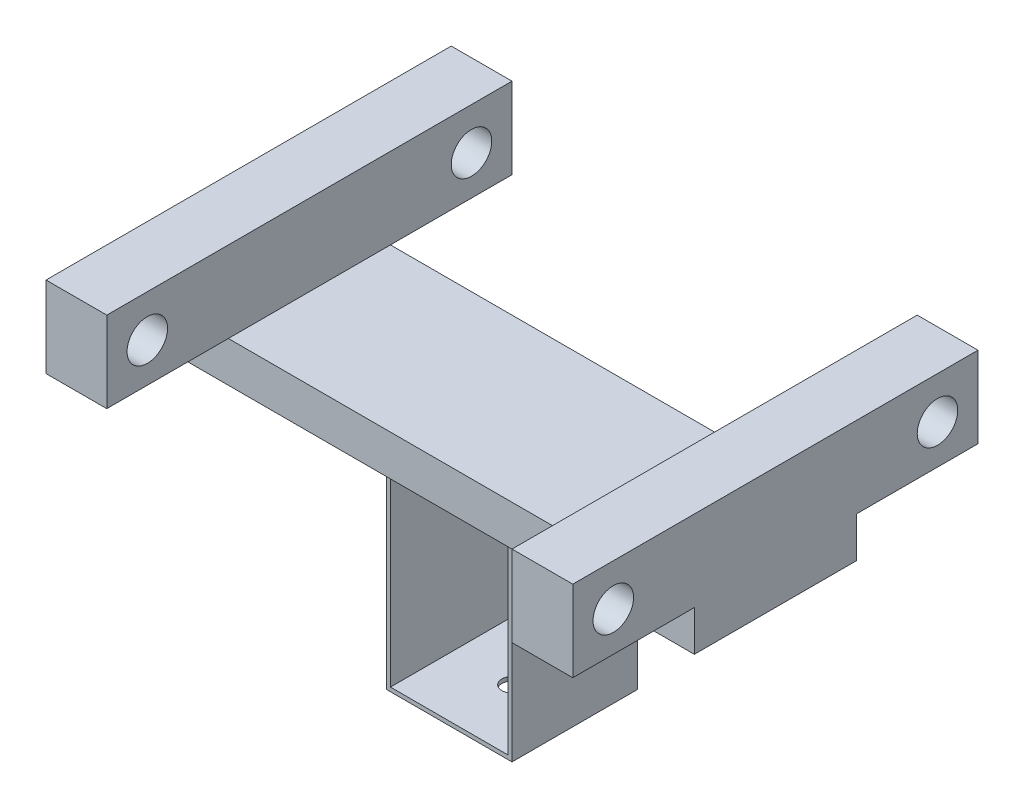
ISO-10303-21;
HEADER;
FILE_DESCRIPTION(('STEP AP214'),'2;1');
FILE_NAME('part.step','',(''),(''),'','','');
FILE_SCHEMA(('AUTOMOTIVE_DESIGN { 1 0 10303 214 1 1 1 1 }'));
ENDSEC;
DATA;
#1=APPLICATION_CONTEXT('core data for automotive mechanical design processes');
#2=APPLICATION_PROTOCOL_DEFINITION('international standard','automotive_design',2000,#1);
#3=PRODUCT_CONTEXT('',#1,'mechanical');
#4=PRODUCT('Part','Part','',(#3));
#5=PRODUCT_RELATED_PRODUCT_CATEGORY('part','',(#4));
#6=PRODUCT_DEFINITION_FORMATION('','',#4);
#7=PRODUCT_DEFINITION_CONTEXT('part definition',#1,'design');
#8=PRODUCT_DEFINITION('design','',#6,#7);
#9=PRODUCT_DEFINITION_SHAPE('','',#8);
#10=(LENGTH_UNIT() NAMED_UNIT(*) SI_UNIT(.MILLI.,.METRE.));
#11=(NAMED_UNIT(*) PLANE_ANGLE_UNIT() SI_UNIT($,.RADIAN.));
#12=(NAMED_UNIT(*) SI_UNIT($,.STERADIAN.) SOLID_ANGLE_UNIT());
#13=UNCERTAINTY_MEASURE_WITH_UNIT(LENGTH_MEASURE(1.E-05),#10,'distance_accuracy_value','');
#14=(GEOMETRIC_REPRESENTATION_CONTEXT(3) GLOBAL_UNCERTAINTY_ASSIGNED_CONTEXT((#13)) GLOBAL_UNIT_ASSIGNED_CONTEXT((#10,
#11,#12)) REPRESENTATION_CONTEXT('',''));
#15=CARTESIAN_POINT('',(0.,0.,0.));
#16=DIRECTION('',(0.,0.,1.));
#17=DIRECTION('',(1.,0.,0.));
#18=AXIS2_PLACEMENT_3D('',#15,#16,#17);
#19=CARTESIAN_POINT('',(0.,10.,0.));
#20=DIRECTION('',(0.,1.,0.));
#21=DIRECTION('',(0.,0.,1.));
#22=AXIS2_PLACEMENT_3D('',#19,#20,#21);
#23=PLANE('',#22);
#24=DIRECTION('',(1.,0.,0.));
#25=VECTOR('',#24,1.);
#26=CARTESIAN_POINT('',(-65.,10.,20.));
#27=LINE('',#26,#25);
#28=CARTESIAN_POINT('',(-50.,10.,20.));
#29=VERTEX_POINT('',#28);
#30=CARTESIAN_POINT('',(50.,10.,20.));
#31=VERTEX_POINT('',#30);
#32=EDGE_CURVE('E424',#29,#31,#27,.T.);
#33=ORIENTED_EDGE('',*,*,#32,.T.);
#34=DIRECTION('',(0.,0.,1.));
#35=VECTOR('',#34,1.);
#36=CARTESIAN_POINT('',(50.,10.,-50.));
#37=LINE('',#36,#35);
#38=CARTESIAN_POINT('',(50.,10.,-20.));
#39=VERTEX_POINT('',#38);
#40=EDGE_CURVE('E60',#39,#31,#37,.T.);
#41=ORIENTED_EDGE('',*,*,#40,.F.);
#42=DIRECTION('',(-1.,0.,0.));
#43=VECTOR('',#42,1.);
#44=CARTESIAN_POINT('',(-65.,10.,-20.));
#45=LINE('',#44,#43);
#46=CARTESIAN_POINT('',(-50.,10.,-20.));
#47=VERTEX_POINT('',#46);
#48=EDGE_CURVE('E417',#39,#47,#45,.T.);
#49=ORIENTED_EDGE('',*,*,#48,.T.);
#50=DIRECTION('',(0.,0.,1.));
#51=VECTOR('',#50,1.);
#52=CARTESIAN_POINT('',(-50.,10.,-50.));
#53=LINE('',#52,#51);
#54=EDGE_CURVE('E11',#47,#29,#53,.T.);
#55=ORIENTED_EDGE('',*,*,#54,.T.);
#56=EDGE_LOOP('',(#33,#41,#49,#55));
#57=FACE_BOUND('',#56,.T.);
#58=ADVANCED_FACE('F41',(#57),#23,.T.);
#59=CARTESIAN_POINT('',(0.,0.,0.));
#60=DIRECTION('',(0.,1.,0.));
#61=DIRECTION('',(0.,0.,1.));
#62=AXIS2_PLACEMENT_3D('',#59,#60,#61);
#63=PLANE('',#62);
#64=DIRECTION('',(0.,0.,-1.));
#65=VECTOR('',#64,1.);
#66=CARTESIAN_POINT('',(65.,0.,-20.));
#67=LINE('',#66,#65);
#68=CARTESIAN_POINT('',(65.,0.,20.));
#69=VERTEX_POINT('',#68);
#70=CARTESIAN_POINT('',(65.,0.,-20.));
#71=VERTEX_POINT('',#70);
#72=EDGE_CURVE('E412',#69,#71,#67,.T.);
#73=ORIENTED_EDGE('',*,*,#72,.F.);
#74=DIRECTION('',(1.,0.,0.));
#75=VECTOR('',#74,1.);
#76=CARTESIAN_POINT('',(-65.,0.,20.));
#77=LINE('',#76,#75);
#78=CARTESIAN_POINT('',(-65.,0.,20.));
#79=VERTEX_POINT('',#78);
#80=EDGE_CURVE('E433',#79,#69,#77,.T.);
#81=ORIENTED_EDGE('',*,*,#80,.F.);
#82=DIRECTION('',(0.,0.,1.));
#83=VECTOR('',#82,1.);
#84=CARTESIAN_POINT('',(-65.,0.,-20.));
#85=LINE('',#84,#83);
#86=CARTESIAN_POINT('',(-65.,0.,-20.));
#87=VERTEX_POINT('',#86);
#88=EDGE_CURVE('E430',#87,#79,#85,.T.);
#89=ORIENTED_EDGE('',*,*,#88,.F.);
#90=DIRECTION('',(-1.,0.,0.));
#91=VECTOR('',#90,1.);
#92=CARTESIAN_POINT('',(-65.,0.,-20.));
#93=LINE('',#92,#91);
#94=EDGE_CURVE('E427',#71,#87,#93,.T.);
#95=ORIENTED_EDGE('',*,*,#94,.F.);
#96=EDGE_LOOP('',(#73,#81,#89,#95));
#97=FACE_BOUND('',#96,.T.);
#98=DIRECTION('',(0.,0.,1.));
#99=VECTOR('',#98,1.);
#100=CARTESIAN_POINT('',(15.5,0.,15.5));
#101=LINE('',#100,#99);
#102=CARTESIAN_POINT('',(15.5,0.,-15.5));
#103=VERTEX_POINT('',#102);
#104=CARTESIAN_POINT('',(15.5,0.,15.5));
#105=VERTEX_POINT('',#104);
#106=EDGE_CURVE('E367',#103,#105,#101,.T.);
#107=ORIENTED_EDGE('',*,*,#106,.F.);
#108=DIRECTION('',(1.,0.,0.));
#109=VECTOR('',#108,1.);
#110=CARTESIAN_POINT('',(-15.5,0.,-15.5));
#111=LINE('',#110,#109);
#112=CARTESIAN_POINT('',(-15.5,0.,-15.5));
#113=VERTEX_POINT('',#112);
#114=EDGE_CURVE('E373',#113,#103,#111,.T.);
#115=ORIENTED_EDGE('',*,*,#114,.F.);
#116=DIRECTION('',(0.,0.,-1.));
#117=VECTOR('',#116,1.);
#118=CARTESIAN_POINT('',(-15.5,0.,15.5));
#119=LINE('',#118,#117);
#120=CARTESIAN_POINT('',(-15.5,0.,15.5));
#121=VERTEX_POINT('',#120);
#122=EDGE_CURVE('E390',#121,#113,#119,.T.);
#123=ORIENTED_EDGE('',*,*,#122,.F.);
#124=DIRECTION('',(-1.,0.,0.));
#125=VECTOR('',#124,1.);
#126=CARTESIAN_POINT('',(-15.5,0.,15.5));
#127=LINE('',#126,#125);
#128=EDGE_CURVE('E386',#105,#121,#127,.T.);
#129=ORIENTED_EDGE('',*,*,#128,.F.);
#130=EDGE_LOOP('',(#107,#115,#123,#129));
#131=FACE_BOUND('',#130,.T.);
#132=ADVANCED_FACE('F456',(#97,#131),#63,.F.);
#133=CARTESIAN_POINT('',(65.,10.,-20.));
#134=DIRECTION('',(-1.,0.,0.));
#135=DIRECTION('',(0.,0.,1.));
#136=AXIS2_PLACEMENT_3D('',#133,#134,#135);
#137=PLANE('',#136);
#138=CARTESIAN_POINT('',(65.,19.6780334730884,40.));
#139=DIRECTION('',(-1.,0.,0.));
#140=DIRECTION('',(0.,0.,1.));
#141=AXIS2_PLACEMENT_3D('',#138,#139,#140);
#142=CIRCLE('',#141,5.);
#143=CARTESIAN_POINT('',(65.,19.6780334730884,45.));
#144=VERTEX_POINT('',#143);
#145=EDGE_CURVE('E237',#144,#144,#142,.F.);
#146=ORIENTED_EDGE('',*,*,#145,.F.);
#147=EDGE_LOOP('',(#146));
#148=FACE_BOUND('',#147,.T.);
#149=CARTESIAN_POINT('',(65.,19.6780334730884,-40.));
#150=DIRECTION('',(-1.,0.,0.));
#151=DIRECTION('',(0.,0.,1.));
#152=AXIS2_PLACEMENT_3D('',#149,#150,#151);
#153=CIRCLE('',#152,5.);
#154=CARTESIAN_POINT('',(65.,19.6780334730884,-35.));
#155=VERTEX_POINT('',#154);
#156=EDGE_CURVE('E486',#155,#155,#153,.F.);
#157=ORIENTED_EDGE('',*,*,#156,.F.);
#158=EDGE_LOOP('',(#157));
#159=FACE_BOUND('',#158,.T.);
#160=ORIENTED_EDGE('',*,*,#72,.T.);
#161=DIRECTION('',(0.,-1.,0.));
#162=VECTOR('',#161,1.);
#163=CARTESIAN_POINT('',(65.,10.,-20.));
#164=LINE('',#163,#162);
#165=CARTESIAN_POINT('',(65.,10.,-20.));
#166=VERTEX_POINT('',#165);
#167=EDGE_CURVE('E45',#166,#71,#164,.T.);
#168=ORIENTED_EDGE('',*,*,#167,.F.);
#169=DIRECTION('',(0.,0.,1.));
#170=VECTOR('',#169,1.);
#171=CARTESIAN_POINT('',(65.,10.,-50.));
#172=LINE('',#171,#170);
#173=CARTESIAN_POINT('',(65.,10.,-50.));
#174=VERTEX_POINT('',#173);
#175=EDGE_CURVE('E203',#174,#166,#172,.T.);
#176=ORIENTED_EDGE('',*,*,#175,.F.);
#177=DIRECTION('',(0.,-1.,0.));
#178=VECTOR('',#177,1.);
#179=CARTESIAN_POINT('',(65.,30.,-50.));
#180=LINE('',#179,#178);
#181=CARTESIAN_POINT('',(65.,30.,-50.));
#182=VERTEX_POINT('',#181);
#183=EDGE_CURVE('E195',#182,#174,#180,.T.);
#184=ORIENTED_EDGE('',*,*,#183,.F.);
#185=DIRECTION('',(0.,0.,1.));
#186=VECTOR('',#185,1.);
#187=CARTESIAN_POINT('',(65.,30.,-50.));
#188=LINE('',#187,#186);
#189=CARTESIAN_POINT('',(65.,30.,50.));
#190=VERTEX_POINT('',#189);
#191=EDGE_CURVE('E200',#182,#190,#188,.T.);
#192=ORIENTED_EDGE('',*,*,#191,.T.);
#193=DIRECTION('',(0.,-1.,0.));
#194=VECTOR('',#193,1.);
#195=CARTESIAN_POINT('',(65.,30.,50.));
#196=LINE('',#195,#194);
#197=CARTESIAN_POINT('',(65.,10.,50.));
#198=VERTEX_POINT('',#197);
#199=EDGE_CURVE('E208',#190,#198,#196,.T.);
#200=ORIENTED_EDGE('',*,*,#199,.T.);
#201=CARTESIAN_POINT('',(65.,10.,20.));
#202=VERTEX_POINT('',#201);
#203=EDGE_CURVE('E236',#202,#198,#172,.T.);
#204=ORIENTED_EDGE('',*,*,#203,.F.);
#205=DIRECTION('',(0.,-1.,0.));
#206=VECTOR('',#205,1.);
#207=CARTESIAN_POINT('',(65.,10.,20.));
#208=LINE('',#207,#206);
#209=EDGE_CURVE('E423',#202,#69,#208,.T.);
#210=ORIENTED_EDGE('',*,*,#209,.T.);
#211=EDGE_LOOP('',(#160,#168,#176,#184,#192,#200,#204,#210));
#212=FACE_BOUND('',#211,.T.);
#213=ADVANCED_FACE('F43',(#148,#159,#212),#137,.F.);
#214=CARTESIAN_POINT('',(-65.,10.,-20.));
#215=DIRECTION('',(0.,0.,1.));
#216=DIRECTION('',(1.,0.,0.));
#217=AXIS2_PLACEMENT_3D('',#214,#215,#216);
#218=PLANE('',#217);
#219=ORIENTED_EDGE('',*,*,#94,.T.);
#220=DIRECTION('',(0.,-1.,0.));
#221=VECTOR('',#220,1.);
#222=CARTESIAN_POINT('',(-65.,10.,-20.));
#223=LINE('',#222,#221);
#224=CARTESIAN_POINT('',(-65.,10.,-20.));
#225=VERTEX_POINT('',#224);
#226=EDGE_CURVE('E442',#225,#87,#223,.T.);
#227=ORIENTED_EDGE('',*,*,#226,.F.);
#228=EDGE_CURVE('E418',#47,#225,#45,.T.);
#229=ORIENTED_EDGE('',*,*,#228,.F.);
#230=ORIENTED_EDGE('',*,*,#48,.F.);
#231=EDGE_CURVE('E413',#166,#39,#45,.T.);
#232=ORIENTED_EDGE('',*,*,#231,.F.);
#233=ORIENTED_EDGE('',*,*,#167,.T.);
#234=EDGE_LOOP('',(#219,#227,#229,#230,#232,#233));
#235=FACE_BOUND('',#234,.T.);
#236=ADVANCED_FACE('F451',(#235),#218,.F.);
#237=CARTESIAN_POINT('',(-65.,10.,-20.));
#238=DIRECTION('',(1.,0.,0.));
#239=DIRECTION('',(0.,0.,-1.));
#240=AXIS2_PLACEMENT_3D('',#237,#238,#239);
#241=PLANE('',#240);
#242=CARTESIAN_POINT('',(-65.,19.6780334730884,40.));
#243=DIRECTION('',(1.,0.,0.));
#244=DIRECTION('',(0.,0.,-1.));
#245=AXIS2_PLACEMENT_3D('',#242,#243,#244);
#246=CIRCLE('',#245,5.);
#247=CARTESIAN_POINT('',(-65.,19.6780334730884,35.));
#248=VERTEX_POINT('',#247);
#249=EDGE_CURVE('E268',#248,#248,#246,.T.);
#250=ORIENTED_EDGE('',*,*,#249,.T.);
#251=EDGE_LOOP('',(#250));
#252=FACE_BOUND('',#251,.T.);
#253=CARTESIAN_POINT('',(-65.,19.6780334730884,-40.));
#254=DIRECTION('',(1.,0.,0.));
#255=DIRECTION('',(0.,0.,-1.));
#256=AXIS2_PLACEMENT_3D('',#253,#254,#255);
#257=CIRCLE('',#256,5.);
#258=CARTESIAN_POINT('',(-65.,19.6780334730884,-45.));
#259=VERTEX_POINT('',#258);
#260=EDGE_CURVE('E261',#259,#259,#257,.T.);
#261=ORIENTED_EDGE('',*,*,#260,.T.);
#262=EDGE_LOOP('',(#261));
#263=FACE_BOUND('',#262,.T.);
#264=ORIENTED_EDGE('',*,*,#88,.T.);
#265=DIRECTION('',(0.,-1.,0.));
#266=VECTOR('',#265,1.);
#267=CARTESIAN_POINT('',(-65.,10.,20.));
#268=LINE('',#267,#266);
#269=CARTESIAN_POINT('',(-65.,10.,20.));
#270=VERTEX_POINT('',#269);
#271=EDGE_CURVE('E439',#270,#79,#268,.T.);
#272=ORIENTED_EDGE('',*,*,#271,.F.);
#273=DIRECTION('',(0.,0.,1.));
#274=VECTOR('',#273,1.);
#275=CARTESIAN_POINT('',(-65.,10.,-50.));
#276=LINE('',#275,#274);
#277=CARTESIAN_POINT('',(-65.,10.,50.));
#278=VERTEX_POINT('',#277);
#279=EDGE_CURVE('E298',#270,#278,#276,.T.);
#280=ORIENTED_EDGE('',*,*,#279,.T.);
#281=DIRECTION('',(0.,-1.,0.));
#282=VECTOR('',#281,1.);
#283=CARTESIAN_POINT('',(-65.,30.,50.));
#284=LINE('',#283,#282);
#285=CARTESIAN_POINT('',(-65.,30.,50.));
#286=VERTEX_POINT('',#285);
#287=EDGE_CURVE('E306',#286,#278,#284,.T.);
#288=ORIENTED_EDGE('',*,*,#287,.F.);
#289=DIRECTION('',(0.,0.,1.));
#290=VECTOR('',#289,1.);
#291=CARTESIAN_POINT('',(-65.,30.,-50.));
#292=LINE('',#291,#290);
#293=CARTESIAN_POINT('',(-65.,30.,-50.));
#294=VERTEX_POINT('',#293);
#295=EDGE_CURVE('E285',#294,#286,#292,.T.);
#296=ORIENTED_EDGE('',*,*,#295,.F.);
#297=DIRECTION('',(0.,-1.,0.));
#298=VECTOR('',#297,1.);
#299=CARTESIAN_POINT('',(-65.,30.,-50.));
#300=LINE('',#299,#298);
#301=CARTESIAN_POINT('',(-65.,10.,-50.));
#302=VERTEX_POINT('',#301);
#303=EDGE_CURVE('E302',#294,#302,#300,.T.);
#304=ORIENTED_EDGE('',*,*,#303,.T.);
#305=EDGE_CURVE('E278',#302,#225,#276,.T.);
#306=ORIENTED_EDGE('',*,*,#305,.T.);
#307=ORIENTED_EDGE('',*,*,#226,.T.);
#308=EDGE_LOOP('',(#264,#272,#280,#288,#296,#304,#306,#307));
#309=FACE_BOUND('',#308,.T.);
#310=ADVANCED_FACE('F459',(#252,#263,#309),#241,.F.);
#311=CARTESIAN_POINT('',(-65.,10.,20.));
#312=DIRECTION('',(0.,0.,-1.));
#313=DIRECTION('',(-1.,0.,0.));
#314=AXIS2_PLACEMENT_3D('',#311,#312,#313);
#315=PLANE('',#314);
#316=ORIENTED_EDGE('',*,*,#80,.T.);
#317=ORIENTED_EDGE('',*,*,#209,.F.);
#318=EDGE_CURVE('E68',#31,#202,#27,.T.);
#319=ORIENTED_EDGE('',*,*,#318,.F.);
#320=ORIENTED_EDGE('',*,*,#32,.F.);
#321=EDGE_CURVE('E419',#270,#29,#27,.T.);
#322=ORIENTED_EDGE('',*,*,#321,.F.);
#323=ORIENTED_EDGE('',*,*,#271,.T.);
#324=EDGE_LOOP('',(#316,#317,#319,#320,#322,#323));
#325=FACE_BOUND('',#324,.T.);
#326=ADVANCED_FACE('F461',(#325),#315,.F.);
#327=CARTESIAN_POINT('',(15.5,-50.,15.5));
#328=DIRECTION('',(-1.,0.,0.));
#329=DIRECTION('',(0.,0.,1.));
#330=AXIS2_PLACEMENT_3D('',#327,#328,#329);
#331=PLANE('',#330);
#332=ORIENTED_EDGE('',*,*,#106,.T.);
#333=DIRECTION('',(0.,1.,0.));
#334=VECTOR('',#333,1.);
#335=CARTESIAN_POINT('',(15.5,-50.,15.5));
#336=LINE('',#335,#334);
#337=CARTESIAN_POINT('',(15.5,-50.,15.5));
#338=VERTEX_POINT('',#337);
#339=EDGE_CURVE('E408',#338,#105,#336,.T.);
#340=ORIENTED_EDGE('',*,*,#339,.F.);
#341=DIRECTION('',(0.,0.,1.));
#342=VECTOR('',#341,1.);
#343=CARTESIAN_POINT('',(15.5,-50.,15.5));
#344=LINE('',#343,#342);
#345=CARTESIAN_POINT('',(15.5,-50.,-15.5));
#346=VERTEX_POINT('',#345);
#347=EDGE_CURVE('E368',#346,#338,#344,.T.);
#348=ORIENTED_EDGE('',*,*,#347,.F.);
#349=DIRECTION('',(0.,1.,0.));
#350=VECTOR('',#349,1.);
#351=CARTESIAN_POINT('',(15.5,-50.,-15.5));
#352=LINE('',#351,#350);
#353=EDGE_CURVE('E382',#346,#103,#352,.T.);
#354=ORIENTED_EDGE('',*,*,#353,.T.);
#355=EDGE_LOOP('',(#332,#340,#348,#354));
#356=FACE_BOUND('',#355,.T.);
#357=ADVANCED_FACE('F522',(#356),#331,.F.);
#358=CARTESIAN_POINT('',(-15.5,-50.,15.5));
#359=DIRECTION('',(0.,0.,-1.));
#360=DIRECTION('',(-1.,0.,0.));
#361=AXIS2_PLACEMENT_3D('',#358,#359,#360);
#362=PLANE('',#361);
#363=DIRECTION('',(-1.,0.,0.));
#364=VECTOR('',#363,1.);
#365=CARTESIAN_POINT('',(-15.5,-49.,15.5));
#366=LINE('',#365,#364);
#367=CARTESIAN_POINT('',(14.5,-49.,15.5));
#368=VERTEX_POINT('',#367);
#369=CARTESIAN_POINT('',(-14.5,-49.,15.5));
#370=VERTEX_POINT('',#369);
#371=EDGE_CURVE('E359',#368,#370,#366,.T.);
#372=ORIENTED_EDGE('',*,*,#371,.T.);
#373=DIRECTION('',(0.,1.,0.));
#374=VECTOR('',#373,1.);
#375=CARTESIAN_POINT('',(-14.5,-50.,15.5));
#376=LINE('',#375,#374);
#377=CARTESIAN_POINT('',(-14.5,-1.,15.5));
#378=VERTEX_POINT('',#377);
#379=EDGE_CURVE('E363',#370,#378,#376,.T.);
#380=ORIENTED_EDGE('',*,*,#379,.T.);
#381=DIRECTION('',(1.,0.,0.));
#382=VECTOR('',#381,1.);
#383=CARTESIAN_POINT('',(-15.5,-1.,15.5));
#384=LINE('',#383,#382);
#385=CARTESIAN_POINT('',(14.5,-1.,15.5));
#386=VERTEX_POINT('',#385);
#387=EDGE_CURVE('E342',#378,#386,#384,.T.);
#388=ORIENTED_EDGE('',*,*,#387,.T.);
#389=DIRECTION('',(0.,-1.,0.));
#390=VECTOR('',#389,1.);
#391=CARTESIAN_POINT('',(14.5,-50.,15.5));
#392=LINE('',#391,#390);
#393=EDGE_CURVE('E355',#386,#368,#392,.T.);
#394=ORIENTED_EDGE('',*,*,#393,.T.);
#395=EDGE_LOOP('',(#372,#380,#388,#394));
#396=FACE_BOUND('',#395,.T.);
#397=ORIENTED_EDGE('',*,*,#128,.T.);
#398=DIRECTION('',(0.,1.,0.));
#399=VECTOR('',#398,1.);
#400=CARTESIAN_POINT('',(-15.5,-50.,15.5));
#401=LINE('',#400,#399);
#402=CARTESIAN_POINT('',(-15.5,-50.,15.5));
#403=VERTEX_POINT('',#402);
#404=EDGE_CURVE('E404',#403,#121,#401,.T.);
#405=ORIENTED_EDGE('',*,*,#404,.F.);
#406=DIRECTION('',(-1.,0.,0.));
#407=VECTOR('',#406,1.);
#408=CARTESIAN_POINT('',(-15.5,-50.,15.5));
#409=LINE('',#408,#407);
#410=EDGE_CURVE('E372',#338,#403,#409,.T.);
#411=ORIENTED_EDGE('',*,*,#410,.F.);
#412=ORIENTED_EDGE('',*,*,#339,.T.);
#413=EDGE_LOOP('',(#397,#405,#411,#412));
#414=FACE_BOUND('',#413,.T.);
#415=ADVANCED_FACE('F595',(#396,#414),#362,.F.);
#416=CARTESIAN_POINT('',(-15.5,-50.,15.5));
#417=DIRECTION('',(1.,0.,0.));
#418=DIRECTION('',(0.,0.,-1.));
#419=AXIS2_PLACEMENT_3D('',#416,#417,#418);
#420=PLANE('',#419);
#421=ORIENTED_EDGE('',*,*,#122,.T.);
#422=DIRECTION('',(0.,1.,0.));
#423=VECTOR('',#422,1.);
#424=CARTESIAN_POINT('',(-15.5,-50.,-15.5));
#425=LINE('',#424,#423);
#426=CARTESIAN_POINT('',(-15.5,-50.,-15.5));
#427=VERTEX_POINT('',#426);
#428=EDGE_CURVE('E400',#427,#113,#425,.T.);
#429=ORIENTED_EDGE('',*,*,#428,.F.);
#430=DIRECTION('',(0.,0.,-1.));
#431=VECTOR('',#430,1.);
#432=CARTESIAN_POINT('',(-15.5,-50.,15.5));
#433=LINE('',#432,#431);
#434=EDGE_CURVE('E376',#403,#427,#433,.T.);
#435=ORIENTED_EDGE('',*,*,#434,.F.);
#436=ORIENTED_EDGE('',*,*,#404,.T.);
#437=EDGE_LOOP('',(#421,#429,#435,#436));
#438=FACE_BOUND('',#437,.T.);
#439=ADVANCED_FACE('F592',(#438),#420,.F.);
#440=CARTESIAN_POINT('',(-15.5,-50.,-15.5));
#441=DIRECTION('',(0.,0.,1.));
#442=DIRECTION('',(1.,0.,0.));
#443=AXIS2_PLACEMENT_3D('',#440,#441,#442);
#444=PLANE('',#443);
#445=DIRECTION('',(1.,0.,0.));
#446=VECTOR('',#445,1.);
#447=CARTESIAN_POINT('',(14.5,-1.,-15.5));
#448=LINE('',#447,#446);
#449=CARTESIAN_POINT('',(-14.5,-1.,-15.5));
#450=VERTEX_POINT('',#449);
#451=CARTESIAN_POINT('',(14.5,-1.,-15.5));
#452=VERTEX_POINT('',#451);
#453=EDGE_CURVE('E326',#450,#452,#448,.T.);
#454=ORIENTED_EDGE('',*,*,#453,.F.);
#455=DIRECTION('',(0.,1.,0.));
#456=VECTOR('',#455,1.);
#457=CARTESIAN_POINT('',(-14.5,-1.,-15.5));
#458=LINE('',#457,#456);
#459=CARTESIAN_POINT('',(-14.5,-49.,-15.5));
#460=VERTEX_POINT('',#459);
#461=EDGE_CURVE('E323',#460,#450,#458,.T.);
#462=ORIENTED_EDGE('',*,*,#461,.F.);
#463=DIRECTION('',(-1.,0.,0.));
#464=VECTOR('',#463,1.);
#465=CARTESIAN_POINT('',(14.5,-49.,-15.5));
#466=LINE('',#465,#464);
#467=CARTESIAN_POINT('',(14.5,-49.,-15.5));
#468=VERTEX_POINT('',#467);
#469=EDGE_CURVE('E334',#468,#460,#466,.T.);
#470=ORIENTED_EDGE('',*,*,#469,.F.);
#471=DIRECTION('',(0.,-1.,0.));
#472=VECTOR('',#471,1.);
#473=CARTESIAN_POINT('',(14.5,-1.,-15.5));
#474=LINE('',#473,#472);
#475=EDGE_CURVE('E330',#452,#468,#474,.T.);
#476=ORIENTED_EDGE('',*,*,#475,.F.);
#477=EDGE_LOOP('',(#454,#462,#470,#476));
#478=FACE_BOUND('',#477,.T.);
#479=ORIENTED_EDGE('',*,*,#114,.T.);
#480=ORIENTED_EDGE('',*,*,#353,.F.);
#481=DIRECTION('',(1.,0.,0.));
#482=VECTOR('',#481,1.);
#483=CARTESIAN_POINT('',(-15.5,-50.,-15.5));
#484=LINE('',#483,#482);
#485=EDGE_CURVE('E379',#427,#346,#484,.T.);
#486=ORIENTED_EDGE('',*,*,#485,.F.);
#487=ORIENTED_EDGE('',*,*,#428,.T.);
#488=EDGE_LOOP('',(#479,#480,#486,#487));
#489=FACE_BOUND('',#488,.T.);
#490=ADVANCED_FACE('F588',(#478,#489),#444,.F.);
#491=CARTESIAN_POINT('',(0.,-50.,0.));
#492=DIRECTION('',(0.,-1.,0.));
#493=DIRECTION('',(0.,0.,-1.));
#494=AXIS2_PLACEMENT_3D('',#491,#492,#493);
#495=PLANE('',#494);
#496=CARTESIAN_POINT('',(0.,-50.,0.));
#497=DIRECTION('',(0.,-1.,0.));
#498=DIRECTION('',(0.,0.,-1.));
#499=AXIS2_PLACEMENT_3D('',#496,#497,#498);
#500=CIRCLE('',#499,2.5);
#501=CARTESIAN_POINT('',(0.,-50.,-2.5));
#502=VERTEX_POINT('',#501);
#503=EDGE_CURVE('E305',#502,#502,#500,.T.);
#504=ORIENTED_EDGE('',*,*,#503,.F.);
#505=EDGE_LOOP('',(#504));
#506=FACE_BOUND('',#505,.T.);
#507=ORIENTED_EDGE('',*,*,#347,.T.);
#508=ORIENTED_EDGE('',*,*,#410,.T.);
#509=ORIENTED_EDGE('',*,*,#434,.T.);
#510=ORIENTED_EDGE('',*,*,#485,.T.);
#511=EDGE_LOOP('',(#507,#508,#509,#510));
#512=FACE_BOUND('',#511,.T.);
#513=ADVANCED_FACE('F584',(#506,#512),#495,.T.);
#514=CARTESIAN_POINT('',(-14.5,-1.,20.));
#515=DIRECTION('',(-1.,0.,0.));
#516=DIRECTION('',(0.,-1.,0.));
#517=AXIS2_PLACEMENT_3D('',#514,#515,#516);
#518=PLANE('',#517);
#519=DIRECTION('',(0.,0.,-1.));
#520=VECTOR('',#519,1.);
#521=CARTESIAN_POINT('',(-14.5,-49.,20.));
#522=LINE('',#521,#520);
#523=EDGE_CURVE('E339',#370,#460,#522,.T.);
#524=ORIENTED_EDGE('',*,*,#523,.T.);
#525=ORIENTED_EDGE('',*,*,#461,.T.);
#526=DIRECTION('',(0.,0.,-1.));
#527=VECTOR('',#526,1.);
#528=CARTESIAN_POINT('',(-14.5,-1.,20.));
#529=LINE('',#528,#527);
#530=EDGE_CURVE('E338',#378,#450,#529,.T.);
#531=ORIENTED_EDGE('',*,*,#530,.F.);
#532=ORIENTED_EDGE('',*,*,#379,.F.);
#533=EDGE_LOOP('',(#524,#525,#531,#532));
#534=FACE_BOUND('',#533,.T.);
#535=ADVANCED_FACE('F574',(#534),#518,.F.);
#536=CARTESIAN_POINT('',(14.5,-49.,20.));
#537=DIRECTION('',(0.,-1.,0.));
#538=DIRECTION('',(0.,0.,-1.));
#539=AXIS2_PLACEMENT_3D('',#536,#537,#538);
#540=PLANE('',#539);
#541=CARTESIAN_POINT('',(0.,-49.,0.));
#542=DIRECTION('',(0.,-1.,0.));
#543=DIRECTION('',(0.,0.,-1.));
#544=AXIS2_PLACEMENT_3D('',#541,#542,#543);
#545=CIRCLE('',#544,2.5);
#546=CARTESIAN_POINT('',(0.,-49.,-2.5));
#547=VERTEX_POINT('',#546);
#548=EDGE_CURVE('E319',#547,#547,#545,.F.);
#549=ORIENTED_EDGE('',*,*,#548,.F.);
#550=EDGE_LOOP('',(#549));
#551=FACE_BOUND('',#550,.T.);
#552=DIRECTION('',(0.,0.,-1.));
#553=VECTOR('',#552,1.);
#554=CARTESIAN_POINT('',(14.5,-49.,20.));
#555=LINE('',#554,#553);
#556=EDGE_CURVE('E343',#368,#468,#555,.T.);
#557=ORIENTED_EDGE('',*,*,#556,.T.);
#558=ORIENTED_EDGE('',*,*,#469,.T.);
#559=ORIENTED_EDGE('',*,*,#523,.F.);
#560=ORIENTED_EDGE('',*,*,#371,.F.);
#561=EDGE_LOOP('',(#557,#558,#559,#560));
#562=FACE_BOUND('',#561,.T.);
#563=ADVANCED_FACE('F570',(#551,#562),#540,.F.);
#564=CARTESIAN_POINT('',(14.5,-1.,20.));
#565=DIRECTION('',(1.,0.,0.));
#566=DIRECTION('',(0.,1.,0.));
#567=AXIS2_PLACEMENT_3D('',#564,#565,#566);
#568=PLANE('',#567);
#569=DIRECTION('',(0.,0.,-1.));
#570=VECTOR('',#569,1.);
#571=CARTESIAN_POINT('',(14.5,-1.,20.));
#572=LINE('',#571,#570);
#573=EDGE_CURVE('E346',#386,#452,#572,.T.);
#574=ORIENTED_EDGE('',*,*,#573,.T.);
#575=ORIENTED_EDGE('',*,*,#475,.T.);
#576=ORIENTED_EDGE('',*,*,#556,.F.);
#577=ORIENTED_EDGE('',*,*,#393,.F.);
#578=EDGE_LOOP('',(#574,#575,#576,#577));
#579=FACE_BOUND('',#578,.T.);
#580=ADVANCED_FACE('F573',(#579),#568,.F.);
#581=CARTESIAN_POINT('',(14.5,-1.,20.));
#582=DIRECTION('',(0.,1.,0.));
#583=DIRECTION('',(0.,0.,1.));
#584=AXIS2_PLACEMENT_3D('',#581,#582,#583);
#585=PLANE('',#584);
#586=ORIENTED_EDGE('',*,*,#530,.T.);
#587=ORIENTED_EDGE('',*,*,#453,.T.);
#588=ORIENTED_EDGE('',*,*,#573,.F.);
#589=ORIENTED_EDGE('',*,*,#387,.F.);
#590=EDGE_LOOP('',(#586,#587,#588,#589));
#591=FACE_BOUND('',#590,.T.);
#592=ADVANCED_FACE('F568',(#591),#585,.F.);
#593=CARTESIAN_POINT('',(0.,10.001,0.));
#594=DIRECTION('',(0.,-1.,0.));
#595=DIRECTION('',(0.,0.,-1.));
#596=AXIS2_PLACEMENT_3D('',#593,#594,#595);
#597=CYLINDRICAL_SURFACE('',#596,2.5);
#598=ORIENTED_EDGE('',*,*,#503,.T.);
#599=EDGE_LOOP('',(#598));
#600=FACE_BOUND('',#599,.T.);
#601=ORIENTED_EDGE('',*,*,#548,.T.);
#602=EDGE_LOOP('',(#601));
#603=FACE_BOUND('',#602,.T.);
#604=ADVANCED_FACE('F565',(#600,#603),#597,.F.);
#605=CARTESIAN_POINT('',(0.,10.,0.));
#606=DIRECTION('',(0.,-1.,0.));
#607=DIRECTION('',(0.,0.,-1.));
#608=AXIS2_PLACEMENT_3D('',#605,#606,#607);
#609=PLANE('',#608);
#610=CARTESIAN_POINT('',(-50.,10.,-50.));
#611=VERTEX_POINT('',#610);
#612=EDGE_CURVE('E52',#611,#47,#53,.T.);
#613=ORIENTED_EDGE('',*,*,#612,.T.);
#614=ORIENTED_EDGE('',*,*,#228,.T.);
#615=ORIENTED_EDGE('',*,*,#305,.F.);
#616=DIRECTION('',(1.,0.,0.));
#617=VECTOR('',#616,1.);
#618=CARTESIAN_POINT('',(-65.,10.,-50.));
#619=LINE('',#618,#617);
#620=EDGE_CURVE('E272',#302,#611,#619,.T.);
#621=ORIENTED_EDGE('',*,*,#620,.T.);
#622=EDGE_LOOP('',(#613,#614,#615,#621));
#623=FACE_BOUND('',#622,.T.);
#624=ADVANCED_FACE('F472',(#623),#609,.T.);
#625=CARTESIAN_POINT('',(-65.,30.,-50.));
#626=DIRECTION('',(0.,0.,-1.));
#627=DIRECTION('',(-1.,0.,0.));
#628=AXIS2_PLACEMENT_3D('',#625,#626,#627);
#629=PLANE('',#628);
#630=ORIENTED_EDGE('',*,*,#620,.F.);
#631=ORIENTED_EDGE('',*,*,#303,.F.);
#632=DIRECTION('',(1.,0.,0.));
#633=VECTOR('',#632,1.);
#634=CARTESIAN_POINT('',(-65.,30.,-50.));
#635=LINE('',#634,#633);
#636=CARTESIAN_POINT('',(-50.,30.,-50.));
#637=VERTEX_POINT('',#636);
#638=EDGE_CURVE('E273',#294,#637,#635,.T.);
#639=ORIENTED_EDGE('',*,*,#638,.T.);
#640=DIRECTION('',(0.,-1.,0.));
#641=VECTOR('',#640,1.);
#642=CARTESIAN_POINT('',(-50.,30.,-50.));
#643=LINE('',#642,#641);
#644=EDGE_CURVE('E288',#637,#611,#643,.T.);
#645=ORIENTED_EDGE('',*,*,#644,.T.);
#646=EDGE_LOOP('',(#630,#631,#639,#645));
#647=FACE_BOUND('',#646,.T.);
#648=ADVANCED_FACE('F557',(#647),#629,.T.);
#649=CARTESIAN_POINT('',(-65.,30.,50.));
#650=DIRECTION('',(0.,0.,-1.));
#651=DIRECTION('',(-1.,0.,0.));
#652=AXIS2_PLACEMENT_3D('',#649,#650,#651);
#653=PLANE('',#652);
#654=DIRECTION('',(1.,0.,0.));
#655=VECTOR('',#654,1.);
#656=CARTESIAN_POINT('',(-65.,10.,50.));
#657=LINE('',#656,#655);
#658=CARTESIAN_POINT('',(-50.,10.,50.));
#659=VERTEX_POINT('',#658);
#660=EDGE_CURVE('E294',#278,#659,#657,.T.);
#661=ORIENTED_EDGE('',*,*,#660,.T.);
#662=DIRECTION('',(0.,-1.,0.));
#663=VECTOR('',#662,1.);
#664=CARTESIAN_POINT('',(-50.,30.,50.));
#665=LINE('',#664,#663);
#666=CARTESIAN_POINT('',(-50.,30.,50.));
#667=VERTEX_POINT('',#666);
#668=EDGE_CURVE('E310',#667,#659,#665,.T.);
#669=ORIENTED_EDGE('',*,*,#668,.F.);
#670=DIRECTION('',(1.,0.,0.));
#671=VECTOR('',#670,1.);
#672=CARTESIAN_POINT('',(-65.,30.,50.));
#673=LINE('',#672,#671);
#674=EDGE_CURVE('E282',#286,#667,#673,.T.);
#675=ORIENTED_EDGE('',*,*,#674,.F.);
#676=ORIENTED_EDGE('',*,*,#287,.T.);
#677=EDGE_LOOP('',(#661,#669,#675,#676));
#678=FACE_BOUND('',#677,.T.);
#679=ADVANCED_FACE('F554',(#678),#653,.F.);
#680=CARTESIAN_POINT('',(-50.,30.,-50.));
#681=DIRECTION('',(1.,0.,0.));
#682=DIRECTION('',(0.,0.,-1.));
#683=AXIS2_PLACEMENT_3D('',#680,#681,#682);
#684=PLANE('',#683);
#685=CARTESIAN_POINT('',(-50.,19.6780334730884,40.));
#686=DIRECTION('',(1.,0.,0.));
#687=DIRECTION('',(0.,0.,-1.));
#688=AXIS2_PLACEMENT_3D('',#685,#686,#687);
#689=CIRCLE('',#688,5.);
#690=CARTESIAN_POINT('',(-50.,19.6780334730884,35.));
#691=VERTEX_POINT('',#690);
#692=EDGE_CURVE('E257',#691,#691,#689,.T.);
#693=ORIENTED_EDGE('',*,*,#692,.F.);
#694=EDGE_LOOP('',(#693));
#695=FACE_BOUND('',#694,.T.);
#696=CARTESIAN_POINT('',(-50.,19.6780334730884,-40.));
#697=DIRECTION('',(1.,0.,0.));
#698=DIRECTION('',(0.,0.,-1.));
#699=AXIS2_PLACEMENT_3D('',#696,#697,#698);
#700=CIRCLE('',#699,5.);
#701=CARTESIAN_POINT('',(-50.,19.6780334730884,-45.));
#702=VERTEX_POINT('',#701);
#703=EDGE_CURVE('E250',#702,#702,#700,.T.);
#704=ORIENTED_EDGE('',*,*,#703,.F.);
#705=EDGE_LOOP('',(#704));
#706=FACE_BOUND('',#705,.T.);
#707=ORIENTED_EDGE('',*,*,#612,.F.);
#708=ORIENTED_EDGE('',*,*,#644,.F.);
#709=DIRECTION('',(0.,0.,1.));
#710=VECTOR('',#709,1.);
#711=CARTESIAN_POINT('',(-50.,30.,-50.));
#712=LINE('',#711,#710);
#713=EDGE_CURVE('E277',#637,#667,#712,.T.);
#714=ORIENTED_EDGE('',*,*,#713,.T.);
#715=ORIENTED_EDGE('',*,*,#668,.T.);
#716=EDGE_CURVE('E53',#29,#659,#53,.T.);
#717=ORIENTED_EDGE('',*,*,#716,.F.);
#718=ORIENTED_EDGE('',*,*,#54,.F.);
#719=EDGE_LOOP('',(#707,#708,#714,#715,#717,#718));
#720=FACE_BOUND('',#719,.T.);
#721=ADVANCED_FACE('F469',(#695,#706,#720),#684,.T.);
#722=CARTESIAN_POINT('',(0.,30.,0.));
#723=DIRECTION('',(0.,-1.,0.));
#724=DIRECTION('',(0.,0.,-1.));
#725=AXIS2_PLACEMENT_3D('',#722,#723,#724);
#726=PLANE('',#725);
#727=ORIENTED_EDGE('',*,*,#638,.F.);
#728=ORIENTED_EDGE('',*,*,#295,.T.);
#729=ORIENTED_EDGE('',*,*,#674,.T.);
#730=ORIENTED_EDGE('',*,*,#713,.F.);
#731=EDGE_LOOP('',(#727,#728,#729,#730));
#732=FACE_BOUND('',#731,.T.);
#733=ADVANCED_FACE('F547',(#732),#726,.F.);
#734=ORIENTED_EDGE('',*,*,#279,.F.);
#735=ORIENTED_EDGE('',*,*,#321,.T.);
#736=ORIENTED_EDGE('',*,*,#716,.T.);
#737=ORIENTED_EDGE('',*,*,#660,.F.);
#738=EDGE_LOOP('',(#734,#735,#736,#737));
#739=FACE_BOUND('',#738,.T.);
#740=ADVANCED_FACE('F463',(#739),#609,.T.);
#741=CARTESIAN_POINT('',(-70.,19.6780334730884,-40.));
#742=DIRECTION('',(1.,0.,0.));
#743=DIRECTION('',(0.,0.,-1.));
#744=AXIS2_PLACEMENT_3D('',#741,#742,#743);
#745=CYLINDRICAL_SURFACE('',#744,5.);
#746=ORIENTED_EDGE('',*,*,#703,.T.);
#747=EDGE_LOOP('',(#746));
#748=FACE_BOUND('',#747,.T.);
#749=ORIENTED_EDGE('',*,*,#260,.F.);
#750=EDGE_LOOP('',(#749));
#751=FACE_BOUND('',#750,.T.);
#752=ADVANCED_FACE('F535',(#748,#751),#745,.F.);
#753=CARTESIAN_POINT('',(-70.,19.6780334730884,40.));
#754=DIRECTION('',(1.,0.,0.));
#755=DIRECTION('',(0.,0.,-1.));
#756=AXIS2_PLACEMENT_3D('',#753,#754,#755);
#757=CYLINDRICAL_SURFACE('',#756,5.);
#758=ORIENTED_EDGE('',*,*,#692,.T.);
#759=EDGE_LOOP('',(#758));
#760=FACE_BOUND('',#759,.T.);
#761=ORIENTED_EDGE('',*,*,#249,.F.);
#762=EDGE_LOOP('',(#761));
#763=FACE_BOUND('',#762,.T.);
#764=ADVANCED_FACE('F537',(#760,#763),#757,.F.);
#765=CARTESIAN_POINT('',(0.,10.,0.));
#766=DIRECTION('',(0.,-1.,0.));
#767=DIRECTION('',(0.,0.,-1.));
#768=AXIS2_PLACEMENT_3D('',#765,#766,#767);
#769=PLANE('',#768);
#770=ORIENTED_EDGE('',*,*,#231,.T.);
#771=CARTESIAN_POINT('',(50.,10.,-50.));
#772=VERTEX_POINT('',#771);
#773=EDGE_CURVE('E219',#772,#39,#37,.T.);
#774=ORIENTED_EDGE('',*,*,#773,.F.);
#775=DIRECTION('',(-1.,0.,0.));
#776=VECTOR('',#775,1.);
#777=CARTESIAN_POINT('',(65.,10.,-50.));
#778=LINE('',#777,#776);
#779=EDGE_CURVE('E233',#174,#772,#778,.T.);
#780=ORIENTED_EDGE('',*,*,#779,.F.);
#781=ORIENTED_EDGE('',*,*,#175,.T.);
#782=EDGE_LOOP('',(#770,#774,#780,#781));
#783=FACE_BOUND('',#782,.T.);
#784=ADVANCED_FACE('F544',(#783),#769,.T.);
#785=ORIENTED_EDGE('',*,*,#318,.T.);
#786=ORIENTED_EDGE('',*,*,#203,.T.);
#787=DIRECTION('',(-1.,0.,0.));
#788=VECTOR('',#787,1.);
#789=CARTESIAN_POINT('',(65.,10.,50.));
#790=LINE('',#789,#788);
#791=CARTESIAN_POINT('',(50.,10.,50.));
#792=VERTEX_POINT('',#791);
#793=EDGE_CURVE('E240',#198,#792,#790,.T.);
#794=ORIENTED_EDGE('',*,*,#793,.T.);
#795=EDGE_CURVE('E244',#31,#792,#37,.T.);
#796=ORIENTED_EDGE('',*,*,#795,.F.);
#797=EDGE_LOOP('',(#785,#786,#794,#796));
#798=FACE_BOUND('',#797,.T.);
#799=ADVANCED_FACE('F480',(#798),#769,.T.);
#800=CARTESIAN_POINT('',(65.,30.,-50.));
#801=DIRECTION('',(0.,0.,1.));
#802=DIRECTION('',(1.,0.,0.));
#803=AXIS2_PLACEMENT_3D('',#800,#801,#802);
#804=PLANE('',#803);
#805=ORIENTED_EDGE('',*,*,#779,.T.);
#806=DIRECTION('',(0.,-1.,0.));
#807=VECTOR('',#806,1.);
#808=CARTESIAN_POINT('',(50.,30.,-50.));
#809=LINE('',#808,#807);
#810=CARTESIAN_POINT('',(50.,30.,-50.));
#811=VERTEX_POINT('',#810);
#812=EDGE_CURVE('E216',#811,#772,#809,.T.);
#813=ORIENTED_EDGE('',*,*,#812,.F.);
#814=DIRECTION('',(-1.,0.,0.));
#815=VECTOR('',#814,1.);
#816=CARTESIAN_POINT('',(65.,30.,-50.));
#817=LINE('',#816,#815);
#818=EDGE_CURVE('E213',#182,#811,#817,.T.);
#819=ORIENTED_EDGE('',*,*,#818,.F.);
#820=ORIENTED_EDGE('',*,*,#183,.T.);
#821=EDGE_LOOP('',(#805,#813,#819,#820));
#822=FACE_BOUND('',#821,.T.);
#823=ADVANCED_FACE('F214',(#822),#804,.F.);
#824=CARTESIAN_POINT('',(50.,30.,-50.));
#825=DIRECTION('',(1.,0.,0.));
#826=DIRECTION('',(0.,0.,-1.));
#827=AXIS2_PLACEMENT_3D('',#824,#825,#826);
#828=PLANE('',#827);
#829=CARTESIAN_POINT('',(50.,19.6780334730884,40.));
#830=DIRECTION('',(1.,0.,0.));
#831=DIRECTION('',(0.,0.,-1.));
#832=AXIS2_PLACEMENT_3D('',#829,#830,#831);
#833=CIRCLE('',#832,5.);
#834=CARTESIAN_POINT('',(50.,19.6780334730884,35.));
#835=VERTEX_POINT('',#834);
#836=EDGE_CURVE('E489',#835,#835,#833,.T.);
#837=ORIENTED_EDGE('',*,*,#836,.T.);
#838=EDGE_LOOP('',(#837));
#839=FACE_BOUND('',#838,.T.);
#840=CARTESIAN_POINT('',(50.,19.6780334730884,-40.));
#841=DIRECTION('',(1.,0.,0.));
#842=DIRECTION('',(0.,0.,-1.));
#843=AXIS2_PLACEMENT_3D('',#840,#841,#842);
#844=CIRCLE('',#843,5.);
#845=CARTESIAN_POINT('',(50.,19.6780334730884,-45.));
#846=VERTEX_POINT('',#845);
#847=EDGE_CURVE('E493',#846,#846,#844,.T.);
#848=ORIENTED_EDGE('',*,*,#847,.T.);
#849=EDGE_LOOP('',(#848));
#850=FACE_BOUND('',#849,.T.);
#851=ORIENTED_EDGE('',*,*,#773,.T.);
#852=ORIENTED_EDGE('',*,*,#40,.T.);
#853=ORIENTED_EDGE('',*,*,#795,.T.);
#854=DIRECTION('',(0.,-1.,0.));
#855=VECTOR('',#854,1.);
#856=CARTESIAN_POINT('',(50.,30.,50.));
#857=LINE('',#856,#855);
#858=CARTESIAN_POINT('',(50.,30.,50.));
#859=VERTEX_POINT('',#858);
#860=EDGE_CURVE('E251',#859,#792,#857,.T.);
#861=ORIENTED_EDGE('',*,*,#860,.F.);
#862=DIRECTION('',(0.,0.,1.));
#863=VECTOR('',#862,1.);
#864=CARTESIAN_POINT('',(50.,30.,-50.));
#865=LINE('',#864,#863);
#866=EDGE_CURVE('E209',#811,#859,#865,.T.);
#867=ORIENTED_EDGE('',*,*,#866,.F.);
#868=ORIENTED_EDGE('',*,*,#812,.T.);
#869=EDGE_LOOP('',(#851,#852,#853,#861,#867,#868));
#870=FACE_BOUND('',#869,.T.);
#871=ADVANCED_FACE('F499',(#839,#850,#870),#828,.F.);
#872=CARTESIAN_POINT('',(65.,30.,50.));
#873=DIRECTION('',(0.,0.,1.));
#874=DIRECTION('',(1.,0.,0.));
#875=AXIS2_PLACEMENT_3D('',#872,#873,#874);
#876=PLANE('',#875);
#877=ORIENTED_EDGE('',*,*,#793,.F.);
#878=ORIENTED_EDGE('',*,*,#199,.F.);
#879=DIRECTION('',(-1.,0.,0.));
#880=VECTOR('',#879,1.);
#881=CARTESIAN_POINT('',(65.,30.,50.));
#882=LINE('',#881,#880);
#883=EDGE_CURVE('E224',#190,#859,#882,.T.);
#884=ORIENTED_EDGE('',*,*,#883,.T.);
#885=ORIENTED_EDGE('',*,*,#860,.T.);
#886=EDGE_LOOP('',(#877,#878,#884,#885));
#887=FACE_BOUND('',#886,.T.);
#888=ADVANCED_FACE('F671',(#887),#876,.T.);
#889=CARTESIAN_POINT('',(0.,30.,0.));
#890=DIRECTION('',(0.,-1.,0.));
#891=DIRECTION('',(0.,0.,-1.));
#892=AXIS2_PLACEMENT_3D('',#889,#890,#891);
#893=PLANE('',#892);
#894=ORIENTED_EDGE('',*,*,#818,.T.);
#895=ORIENTED_EDGE('',*,*,#866,.T.);
#896=ORIENTED_EDGE('',*,*,#883,.F.);
#897=ORIENTED_EDGE('',*,*,#191,.F.);
#898=EDGE_LOOP('',(#894,#895,#896,#897));
#899=FACE_BOUND('',#898,.T.);
#900=ADVANCED_FACE('F222',(#899),#893,.F.);
#901=CARTESIAN_POINT('',(70.,19.6780334730884,-40.));
#902=DIRECTION('',(-1.,0.,0.));
#903=DIRECTION('',(0.,0.,1.));
#904=AXIS2_PLACEMENT_3D('',#901,#902,#903);
#905=CYLINDRICAL_SURFACE('',#904,5.);
#906=ORIENTED_EDGE('',*,*,#847,.F.);
#907=EDGE_LOOP('',(#906));
#908=FACE_BOUND('',#907,.T.);
#909=ORIENTED_EDGE('',*,*,#156,.T.);
#910=EDGE_LOOP('',(#909));
#911=FACE_BOUND('',#910,.T.);
#912=ADVANCED_FACE('F502',(#908,#911),#905,.F.);
#913=CARTESIAN_POINT('',(70.,19.6780334730884,40.));
#914=DIRECTION('',(-1.,0.,0.));
#915=DIRECTION('',(0.,0.,1.));
#916=AXIS2_PLACEMENT_3D('',#913,#914,#915);
#917=CYLINDRICAL_SURFACE('',#916,5.);
#918=ORIENTED_EDGE('',*,*,#836,.F.);
#919=EDGE_LOOP('',(#918));
#920=FACE_BOUND('',#919,.T.);
#921=ORIENTED_EDGE('',*,*,#145,.T.);
#922=EDGE_LOOP('',(#921));
#923=FACE_BOUND('',#922,.T.);
#924=ADVANCED_FACE('F505',(#920,#923),#917,.F.);
#925=CLOSED_SHELL('',(#58,#132,#213,#236,#310,#326,#357,#415,#439,#490,#513,#535,#563,#580,#592,
#604,#624,#648,#679,#721,#733,#740,#752,#764,#784,#799,#823,#871,#888,#900,#912,#924));
#926=MANIFOLD_SOLID_BREP('B2',#925);
#927=ADVANCED_BREP_SHAPE_REPRESENTATION('',(#18,#926),#14);
#928=SHAPE_DEFINITION_REPRESENTATION(#9,#927);
ENDSEC;
END-ISO-10303-21;
